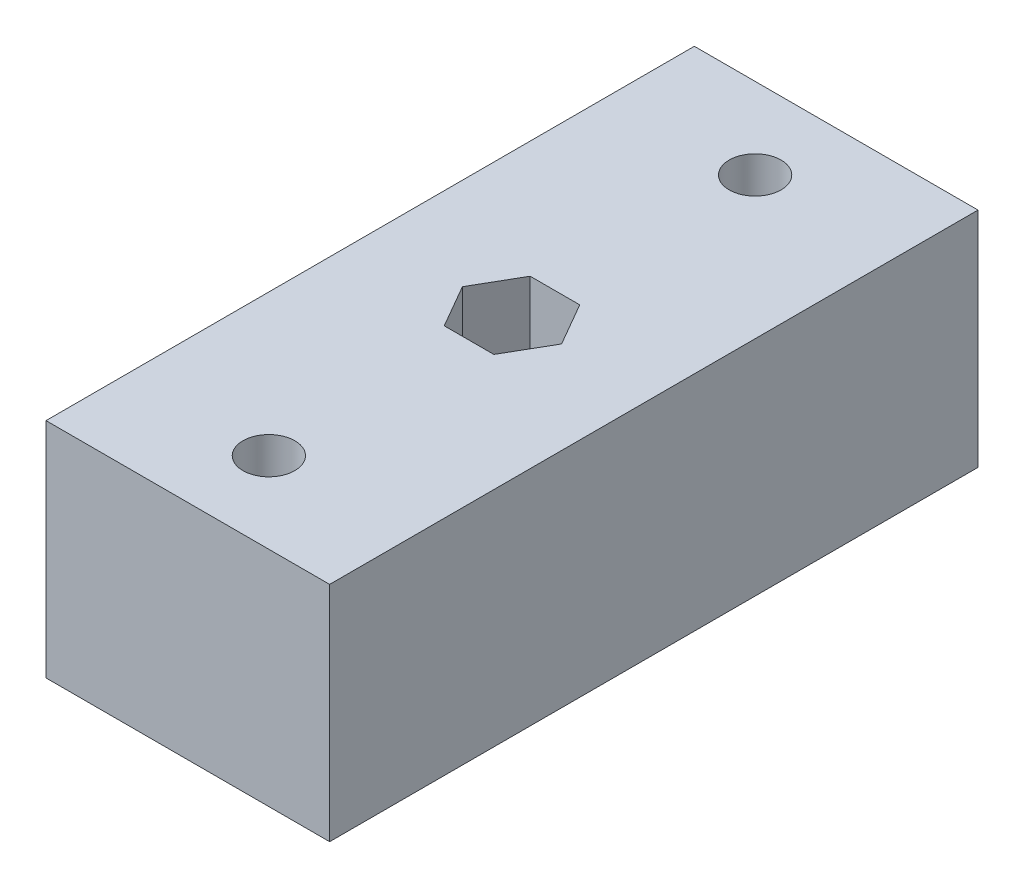
ISO-10303-21;
HEADER;
FILE_DESCRIPTION(('STEP AP214'),'2;1');
FILE_NAME('part.step','',(''),(''),'','','');
FILE_SCHEMA(('AUTOMOTIVE_DESIGN { 1 0 10303 214 1 1 1 1 }'));
ENDSEC;
DATA;
#1=APPLICATION_CONTEXT('core data for automotive mechanical design processes');
#2=APPLICATION_PROTOCOL_DEFINITION('international standard','automotive_design',2000,#1);
#3=PRODUCT_CONTEXT('',#1,'mechanical');
#4=PRODUCT('Part','Part','',(#3));
#5=PRODUCT_RELATED_PRODUCT_CATEGORY('part','',(#4));
#6=PRODUCT_DEFINITION_FORMATION('','',#4);
#7=PRODUCT_DEFINITION_CONTEXT('part definition',#1,'design');
#8=PRODUCT_DEFINITION('design','',#6,#7);
#9=PRODUCT_DEFINITION_SHAPE('','',#8);
#10=(LENGTH_UNIT() NAMED_UNIT(*) SI_UNIT(.MILLI.,.METRE.));
#11=(NAMED_UNIT(*) PLANE_ANGLE_UNIT() SI_UNIT($,.RADIAN.));
#12=(NAMED_UNIT(*) SI_UNIT($,.STERADIAN.) SOLID_ANGLE_UNIT());
#13=UNCERTAINTY_MEASURE_WITH_UNIT(LENGTH_MEASURE(1.E-05),#10,'distance_accuracy_value','');
#14=(GEOMETRIC_REPRESENTATION_CONTEXT(3) GLOBAL_UNCERTAINTY_ASSIGNED_CONTEXT((#13)) GLOBAL_UNIT_ASSIGNED_CONTEXT((#10,
#11,#12)) REPRESENTATION_CONTEXT('',''));
#15=CARTESIAN_POINT('',(0.,0.,0.));
#16=DIRECTION('',(0.,0.,1.));
#17=DIRECTION('',(1.,0.,0.));
#18=AXIS2_PLACEMENT_3D('',#15,#16,#17);
#19=CARTESIAN_POINT('',(0.,0.,50.8));
#20=DIRECTION('',(1.,0.,0.));
#21=DIRECTION('',(0.,0.,-1.));
#22=AXIS2_PLACEMENT_3D('',#19,#20,#21);
#23=PLANE('',#22);
#24=DIRECTION('',(0.,-1.,0.));
#25=VECTOR('',#24,1.);
#26=CARTESIAN_POINT('',(0.,0.,0.));
#27=LINE('',#26,#25);
#28=CARTESIAN_POINT('',(0.,17.4625,0.));
#29=VERTEX_POINT('',#28);
#30=CARTESIAN_POINT('',(0.,0.,0.));
#31=VERTEX_POINT('',#30);
#32=EDGE_CURVE('E156',#29,#31,#27,.T.);
#33=ORIENTED_EDGE('',*,*,#32,.T.);
#34=DIRECTION('',(0.,0.,-1.));
#35=VECTOR('',#34,1.);
#36=CARTESIAN_POINT('',(0.,0.,50.8));
#37=LINE('',#36,#35);
#38=CARTESIAN_POINT('',(0.,0.,50.8));
#39=VERTEX_POINT('',#38);
#40=EDGE_CURVE('E11',#39,#31,#37,.T.);
#41=ORIENTED_EDGE('',*,*,#40,.F.);
#42=DIRECTION('',(0.,-1.,0.));
#43=VECTOR('',#42,1.);
#44=CARTESIAN_POINT('',(0.,0.,50.8));
#45=LINE('',#44,#43);
#46=CARTESIAN_POINT('',(0.,17.4625,50.8));
#47=VERTEX_POINT('',#46);
#48=EDGE_CURVE('E204',#47,#39,#45,.T.);
#49=ORIENTED_EDGE('',*,*,#48,.F.);
#50=DIRECTION('',(0.,0.,-1.));
#51=VECTOR('',#50,1.);
#52=CARTESIAN_POINT('',(0.,17.4625,50.8));
#53=LINE('',#52,#51);
#54=EDGE_CURVE('E220',#47,#29,#53,.T.);
#55=ORIENTED_EDGE('',*,*,#54,.T.);
#56=EDGE_LOOP('',(#33,#41,#49,#55));
#57=FACE_BOUND('',#56,.T.);
#58=ADVANCED_FACE('F44',(#57),#23,.F.);
#59=CARTESIAN_POINT('',(0.,0.,50.8));
#60=DIRECTION('',(0.,1.,0.));
#61=DIRECTION('',(0.,0.,1.));
#62=AXIS2_PLACEMENT_3D('',#59,#60,#61);
#63=PLANE('',#62);
#64=CARTESIAN_POINT('',(11.1125,0.,6.35));
#65=DIRECTION('',(0.,-1.,0.));
#66=DIRECTION('',(0.,0.,-1.));
#67=AXIS2_PLACEMENT_3D('',#64,#65,#66);
#68=CIRCLE('',#67,2.032);
#69=CARTESIAN_POINT('',(11.1125,0.,4.318));
#70=VERTEX_POINT('',#69);
#71=EDGE_CURVE('E313',#70,#70,#68,.T.);
#72=ORIENTED_EDGE('',*,*,#71,.F.);
#73=EDGE_LOOP('',(#72));
#74=FACE_BOUND('',#73,.T.);
#75=CARTESIAN_POINT('',(11.1125,0.,44.45));
#76=DIRECTION('',(0.,-1.,0.));
#77=DIRECTION('',(0.,0.,-1.));
#78=AXIS2_PLACEMENT_3D('',#75,#76,#77);
#79=CIRCLE('',#78,2.032);
#80=CARTESIAN_POINT('',(11.1125,0.,42.418));
#81=VERTEX_POINT('',#80);
#82=EDGE_CURVE('E305',#81,#81,#79,.T.);
#83=ORIENTED_EDGE('',*,*,#82,.F.);
#84=EDGE_LOOP('',(#83));
#85=FACE_BOUND('',#84,.T.);
#86=DIRECTION('',(-0.5,0.,0.866025403784438));
#87=VECTOR('',#86,1.);
#88=CARTESIAN_POINT('',(14.9986446619154,0.,25.4));
#89=LINE('',#88,#87);
#90=CARTESIAN_POINT('',(14.9986446619154,0.,25.4));
#91=VERTEX_POINT('',#90);
#92=CARTESIAN_POINT('',(13.0555723309577,0.,28.7655));
#93=VERTEX_POINT('',#92);
#94=EDGE_CURVE('E169',#91,#93,#89,.T.);
#95=ORIENTED_EDGE('',*,*,#94,.F.);
#96=DIRECTION('',(0.5,0.,0.866025403784439));
#97=VECTOR('',#96,1.);
#98=CARTESIAN_POINT('',(13.0555723309577,0.,22.0345));
#99=LINE('',#98,#97);
#100=CARTESIAN_POINT('',(13.0555723309577,0.,22.0345));
#101=VERTEX_POINT('',#100);
#102=EDGE_CURVE('E65',#101,#91,#99,.T.);
#103=ORIENTED_EDGE('',*,*,#102,.F.);
#104=DIRECTION('',(1.,0.,0.));
#105=VECTOR('',#104,1.);
#106=CARTESIAN_POINT('',(9.16942766904231,0.,22.0345));
#107=LINE('',#106,#105);
#108=CARTESIAN_POINT('',(9.16942766904231,0.,22.0345));
#109=VERTEX_POINT('',#108);
#110=EDGE_CURVE('E149',#109,#101,#107,.T.);
#111=ORIENTED_EDGE('',*,*,#110,.F.);
#112=DIRECTION('',(0.5,0.,-0.866025403784439));
#113=VECTOR('',#112,1.);
#114=CARTESIAN_POINT('',(7.22635533808462,0.,25.4));
#115=LINE('',#114,#113);
#116=CARTESIAN_POINT('',(7.22635533808462,0.,25.4));
#117=VERTEX_POINT('',#116);
#118=EDGE_CURVE('E184',#117,#109,#115,.T.);
#119=ORIENTED_EDGE('',*,*,#118,.F.);
#120=DIRECTION('',(-0.5,0.,-0.866025403784439));
#121=VECTOR('',#120,1.);
#122=CARTESIAN_POINT('',(9.16942766904231,0.,28.7655));
#123=LINE('',#122,#121);
#124=CARTESIAN_POINT('',(9.16942766904231,0.,28.7655));
#125=VERTEX_POINT('',#124);
#126=EDGE_CURVE('E180',#125,#117,#123,.T.);
#127=ORIENTED_EDGE('',*,*,#126,.F.);
#128=DIRECTION('',(-1.,0.,0.));
#129=VECTOR('',#128,1.);
#130=CARTESIAN_POINT('',(13.0555723309577,0.,28.7655));
#131=LINE('',#130,#129);
#132=EDGE_CURVE('E177',#93,#125,#131,.T.);
#133=ORIENTED_EDGE('',*,*,#132,.F.);
#134=EDGE_LOOP('',(#95,#103,#111,#119,#127,#133));
#135=FACE_BOUND('',#134,.T.);
#136=DIRECTION('',(1.,0.,0.));
#137=VECTOR('',#136,1.);
#138=CARTESIAN_POINT('',(0.,0.,0.));
#139=LINE('',#138,#137);
#140=CARTESIAN_POINT('',(22.225,0.,0.));
#141=VERTEX_POINT('',#140);
#142=EDGE_CURVE('E222',#31,#141,#139,.T.);
#143=ORIENTED_EDGE('',*,*,#142,.T.);
#144=DIRECTION('',(0.,0.,-1.));
#145=VECTOR('',#144,1.);
#146=CARTESIAN_POINT('',(22.225,0.,50.8));
#147=LINE('',#146,#145);
#148=CARTESIAN_POINT('',(22.225,0.,50.8));
#149=VERTEX_POINT('',#148);
#150=EDGE_CURVE('E52',#149,#141,#147,.T.);
#151=ORIENTED_EDGE('',*,*,#150,.F.);
#152=DIRECTION('',(1.,0.,0.));
#153=VECTOR('',#152,1.);
#154=CARTESIAN_POINT('',(0.,0.,50.8));
#155=LINE('',#154,#153);
#156=EDGE_CURVE('E208',#39,#149,#155,.T.);
#157=ORIENTED_EDGE('',*,*,#156,.F.);
#158=ORIENTED_EDGE('',*,*,#40,.T.);
#159=EDGE_LOOP('',(#143,#151,#157,#158));
#160=FACE_BOUND('',#159,.T.);
#161=ADVANCED_FACE('F254',(#74,#85,#135,#160),#63,.F.);
#162=CARTESIAN_POINT('',(22.225,0.,50.8));
#163=DIRECTION('',(-1.,0.,0.));
#164=DIRECTION('',(0.,0.,1.));
#165=AXIS2_PLACEMENT_3D('',#162,#163,#164);
#166=PLANE('',#165);
#167=DIRECTION('',(0.,1.,0.));
#168=VECTOR('',#167,1.);
#169=CARTESIAN_POINT('',(22.225,0.,0.));
#170=LINE('',#169,#168);
#171=CARTESIAN_POINT('',(22.225,17.4625,0.));
#172=VERTEX_POINT('',#171);
#173=EDGE_CURVE('E221',#141,#172,#170,.T.);
#174=ORIENTED_EDGE('',*,*,#173,.T.);
#175=DIRECTION('',(0.,0.,-1.));
#176=VECTOR('',#175,1.);
#177=CARTESIAN_POINT('',(22.225,17.4625,50.8));
#178=LINE('',#177,#176);
#179=CARTESIAN_POINT('',(22.225,17.4625,50.8));
#180=VERTEX_POINT('',#179);
#181=EDGE_CURVE('E232',#180,#172,#178,.T.);
#182=ORIENTED_EDGE('',*,*,#181,.F.);
#183=DIRECTION('',(0.,1.,0.));
#184=VECTOR('',#183,1.);
#185=CARTESIAN_POINT('',(22.225,0.,50.8));
#186=LINE('',#185,#184);
#187=EDGE_CURVE('E215',#149,#180,#186,.T.);
#188=ORIENTED_EDGE('',*,*,#187,.F.);
#189=ORIENTED_EDGE('',*,*,#150,.T.);
#190=EDGE_LOOP('',(#174,#182,#188,#189));
#191=FACE_BOUND('',#190,.T.);
#192=ADVANCED_FACE('F242',(#191),#166,.F.);
#193=CARTESIAN_POINT('',(0.,17.4625,50.8));
#194=DIRECTION('',(0.,-1.,0.));
#195=DIRECTION('',(0.,0.,-1.));
#196=AXIS2_PLACEMENT_3D('',#193,#194,#195);
#197=PLANE('',#196);
#198=CARTESIAN_POINT('',(11.1125,17.4625,6.35));
#199=DIRECTION('',(0.,-1.,0.));
#200=DIRECTION('',(0.,0.,-1.));
#201=AXIS2_PLACEMENT_3D('',#198,#199,#200);
#202=CIRCLE('',#201,2.032);
#203=CARTESIAN_POINT('',(11.1125,17.4625,4.318));
#204=VERTEX_POINT('',#203);
#205=EDGE_CURVE('E320',#204,#204,#202,.F.);
#206=ORIENTED_EDGE('',*,*,#205,.F.);
#207=EDGE_LOOP('',(#206));
#208=FACE_BOUND('',#207,.T.);
#209=CARTESIAN_POINT('',(11.1125,17.4625,44.45));
#210=DIRECTION('',(0.,-1.,0.));
#211=DIRECTION('',(0.,0.,-1.));
#212=AXIS2_PLACEMENT_3D('',#209,#210,#211);
#213=CIRCLE('',#212,2.032);
#214=CARTESIAN_POINT('',(11.1125,17.4625,42.418));
#215=VERTEX_POINT('',#214);
#216=EDGE_CURVE('E306',#215,#215,#213,.F.);
#217=ORIENTED_EDGE('',*,*,#216,.F.);
#218=EDGE_LOOP('',(#217));
#219=FACE_BOUND('',#218,.T.);
#220=DIRECTION('',(-1.,0.,0.));
#221=VECTOR('',#220,1.);
#222=CARTESIAN_POINT('',(9.16942766904231,17.4625,22.0345));
#223=LINE('',#222,#221);
#224=CARTESIAN_POINT('',(13.0555723309577,17.4625,22.0345));
#225=VERTEX_POINT('',#224);
#226=CARTESIAN_POINT('',(9.16942766904231,17.4625,22.0345));
#227=VERTEX_POINT('',#226);
#228=EDGE_CURVE('E162',#225,#227,#223,.T.);
#229=ORIENTED_EDGE('',*,*,#228,.F.);
#230=DIRECTION('',(-0.5,0.,-0.866025403784439));
#231=VECTOR('',#230,1.);
#232=CARTESIAN_POINT('',(13.0555723309577,17.4625,22.0345));
#233=LINE('',#232,#231);
#234=CARTESIAN_POINT('',(14.9986446619154,17.4625,25.4));
#235=VERTEX_POINT('',#234);
#236=EDGE_CURVE('E142',#235,#225,#233,.T.);
#237=ORIENTED_EDGE('',*,*,#236,.F.);
#238=DIRECTION('',(0.5,0.,-0.866025403784439));
#239=VECTOR('',#238,1.);
#240=CARTESIAN_POINT('',(14.9986446619154,17.4625,25.4));
#241=LINE('',#240,#239);
#242=CARTESIAN_POINT('',(13.0555723309577,17.4625,28.7655));
#243=VERTEX_POINT('',#242);
#244=EDGE_CURVE('E155',#243,#235,#241,.T.);
#245=ORIENTED_EDGE('',*,*,#244,.F.);
#246=DIRECTION('',(1.,0.,0.));
#247=VECTOR('',#246,1.);
#248=CARTESIAN_POINT('',(13.0555723309577,17.4625,28.7655));
#249=LINE('',#248,#247);
#250=CARTESIAN_POINT('',(9.16942766904231,17.4625,28.7655));
#251=VERTEX_POINT('',#250);
#252=EDGE_CURVE('E71',#251,#243,#249,.T.);
#253=ORIENTED_EDGE('',*,*,#252,.F.);
#254=DIRECTION('',(0.5,0.,0.866025403784439));
#255=VECTOR('',#254,1.);
#256=CARTESIAN_POINT('',(9.16942766904231,17.4625,28.7655));
#257=LINE('',#256,#255);
#258=CARTESIAN_POINT('',(7.22635533808462,17.4625,25.4));
#259=VERTEX_POINT('',#258);
#260=EDGE_CURVE('E324',#259,#251,#257,.T.);
#261=ORIENTED_EDGE('',*,*,#260,.F.);
#262=DIRECTION('',(-0.5,0.,0.866025403784439));
#263=VECTOR('',#262,1.);
#264=CARTESIAN_POINT('',(7.22635533808462,17.4625,25.4));
#265=LINE('',#264,#263);
#266=EDGE_CURVE('E172',#227,#259,#265,.T.);
#267=ORIENTED_EDGE('',*,*,#266,.F.);
#268=EDGE_LOOP('',(#229,#237,#245,#253,#261,#267));
#269=FACE_BOUND('',#268,.T.);
#270=DIRECTION('',(-1.,0.,0.));
#271=VECTOR('',#270,1.);
#272=CARTESIAN_POINT('',(0.,17.4625,0.));
#273=LINE('',#272,#271);
#274=EDGE_CURVE('E207',#172,#29,#273,.T.);
#275=ORIENTED_EDGE('',*,*,#274,.T.);
#276=ORIENTED_EDGE('',*,*,#54,.F.);
#277=DIRECTION('',(-1.,0.,0.));
#278=VECTOR('',#277,1.);
#279=CARTESIAN_POINT('',(0.,17.4625,50.8));
#280=LINE('',#279,#278);
#281=EDGE_CURVE('E212',#180,#47,#280,.T.);
#282=ORIENTED_EDGE('',*,*,#281,.F.);
#283=ORIENTED_EDGE('',*,*,#181,.T.);
#284=EDGE_LOOP('',(#275,#276,#282,#283));
#285=FACE_BOUND('',#284,.T.);
#286=ADVANCED_FACE('F157',(#208,#219,#269,#285),#197,.F.);
#287=CARTESIAN_POINT('',(0.,0.,50.8));
#288=DIRECTION('',(0.,0.,-1.));
#289=DIRECTION('',(-1.,0.,0.));
#290=AXIS2_PLACEMENT_3D('',#287,#288,#289);
#291=PLANE('',#290);
#292=ORIENTED_EDGE('',*,*,#48,.T.);
#293=ORIENTED_EDGE('',*,*,#156,.T.);
#294=ORIENTED_EDGE('',*,*,#187,.T.);
#295=ORIENTED_EDGE('',*,*,#281,.T.);
#296=EDGE_LOOP('',(#292,#293,#294,#295));
#297=FACE_BOUND('',#296,.T.);
#298=ADVANCED_FACE('F255',(#297),#291,.F.);
#299=CARTESIAN_POINT('',(0.,0.,0.));
#300=DIRECTION('',(0.,0.,-1.));
#301=DIRECTION('',(-1.,0.,0.));
#302=AXIS2_PLACEMENT_3D('',#299,#300,#301);
#303=PLANE('',#302);
#304=ORIENTED_EDGE('',*,*,#32,.F.);
#305=ORIENTED_EDGE('',*,*,#274,.F.);
#306=ORIENTED_EDGE('',*,*,#173,.F.);
#307=ORIENTED_EDGE('',*,*,#142,.F.);
#308=EDGE_LOOP('',(#304,#305,#306,#307));
#309=FACE_BOUND('',#308,.T.);
#310=ADVANCED_FACE('F247',(#309),#303,.T.);
#311=CARTESIAN_POINT('',(13.0555723309577,17.4635,22.0345));
#312=DIRECTION('',(0.866025403784439,0.,-0.5));
#313=DIRECTION('',(-0.5,0.,-0.866025403784439));
#314=AXIS2_PLACEMENT_3D('',#311,#312,#313);
#315=PLANE('',#314);
#316=ORIENTED_EDGE('',*,*,#236,.T.);
#317=DIRECTION('',(0.,-1.,0.));
#318=VECTOR('',#317,1.);
#319=CARTESIAN_POINT('',(13.0555723309577,17.4635,22.0345));
#320=LINE('',#319,#318);
#321=EDGE_CURVE('E160',#225,#101,#320,.T.);
#322=ORIENTED_EDGE('',*,*,#321,.T.);
#323=ORIENTED_EDGE('',*,*,#102,.T.);
#324=DIRECTION('',(0.,-1.,0.));
#325=VECTOR('',#324,1.);
#326=CARTESIAN_POINT('',(14.9986446619154,17.4635,25.4));
#327=LINE('',#326,#325);
#328=EDGE_CURVE('E139',#235,#91,#327,.T.);
#329=ORIENTED_EDGE('',*,*,#328,.F.);
#330=EDGE_LOOP('',(#316,#322,#323,#329));
#331=FACE_BOUND('',#330,.T.);
#332=ADVANCED_FACE('F140',(#331),#315,.F.);
#333=CARTESIAN_POINT('',(9.16942766904231,17.4635,22.0345));
#334=DIRECTION('',(0.,0.,-1.));
#335=DIRECTION('',(-1.,0.,0.));
#336=AXIS2_PLACEMENT_3D('',#333,#334,#335);
#337=PLANE('',#336);
#338=ORIENTED_EDGE('',*,*,#228,.T.);
#339=DIRECTION('',(0.,-1.,0.));
#340=VECTOR('',#339,1.);
#341=CARTESIAN_POINT('',(9.16942766904231,17.4635,22.0345));
#342=LINE('',#341,#340);
#343=EDGE_CURVE('E194',#227,#109,#342,.T.);
#344=ORIENTED_EDGE('',*,*,#343,.T.);
#345=ORIENTED_EDGE('',*,*,#110,.T.);
#346=ORIENTED_EDGE('',*,*,#321,.F.);
#347=EDGE_LOOP('',(#338,#344,#345,#346));
#348=FACE_BOUND('',#347,.T.);
#349=ADVANCED_FACE('F274',(#348),#337,.F.);
#350=CARTESIAN_POINT('',(7.22635533808462,17.4635,25.4));
#351=DIRECTION('',(-0.866025403784439,0.,-0.5));
#352=DIRECTION('',(-0.5,0.,0.866025403784439));
#353=AXIS2_PLACEMENT_3D('',#350,#351,#352);
#354=PLANE('',#353);
#355=ORIENTED_EDGE('',*,*,#266,.T.);
#356=DIRECTION('',(0.,-1.,0.));
#357=VECTOR('',#356,1.);
#358=CARTESIAN_POINT('',(7.22635533808462,17.4635,25.4));
#359=LINE('',#358,#357);
#360=EDGE_CURVE('E198',#259,#117,#359,.T.);
#361=ORIENTED_EDGE('',*,*,#360,.T.);
#362=ORIENTED_EDGE('',*,*,#118,.T.);
#363=ORIENTED_EDGE('',*,*,#343,.F.);
#364=EDGE_LOOP('',(#355,#361,#362,#363));
#365=FACE_BOUND('',#364,.T.);
#366=ADVANCED_FACE('F281',(#365),#354,.F.);
#367=CARTESIAN_POINT('',(9.16942766904231,17.4635,28.7655));
#368=DIRECTION('',(-0.866025403784439,0.,0.5));
#369=DIRECTION('',(0.5,0.,0.866025403784439));
#370=AXIS2_PLACEMENT_3D('',#367,#368,#369);
#371=PLANE('',#370);
#372=ORIENTED_EDGE('',*,*,#260,.T.);
#373=DIRECTION('',(0.,-1.,0.));
#374=VECTOR('',#373,1.);
#375=CARTESIAN_POINT('',(9.16942766904231,17.4635,28.7655));
#376=LINE('',#375,#374);
#377=EDGE_CURVE('E200',#251,#125,#376,.T.);
#378=ORIENTED_EDGE('',*,*,#377,.T.);
#379=ORIENTED_EDGE('',*,*,#126,.T.);
#380=ORIENTED_EDGE('',*,*,#360,.F.);
#381=EDGE_LOOP('',(#372,#378,#379,#380));
#382=FACE_BOUND('',#381,.T.);
#383=ADVANCED_FACE('F282',(#382),#371,.F.);
#384=CARTESIAN_POINT('',(13.0555723309577,17.4635,28.7655));
#385=DIRECTION('',(0.,0.,1.));
#386=DIRECTION('',(1.,0.,0.));
#387=AXIS2_PLACEMENT_3D('',#384,#385,#386);
#388=PLANE('',#387);
#389=ORIENTED_EDGE('',*,*,#252,.T.);
#390=DIRECTION('',(0.,-1.,0.));
#391=VECTOR('',#390,1.);
#392=CARTESIAN_POINT('',(13.0555723309577,17.4635,28.7655));
#393=LINE('',#392,#391);
#394=EDGE_CURVE('E146',#243,#93,#393,.T.);
#395=ORIENTED_EDGE('',*,*,#394,.T.);
#396=ORIENTED_EDGE('',*,*,#132,.T.);
#397=ORIENTED_EDGE('',*,*,#377,.F.);
#398=EDGE_LOOP('',(#389,#395,#396,#397));
#399=FACE_BOUND('',#398,.T.);
#400=ADVANCED_FACE('F279',(#399),#388,.F.);
#401=CARTESIAN_POINT('',(14.9986446619154,17.4635,25.4));
#402=DIRECTION('',(0.866025403784439,0.,0.5));
#403=DIRECTION('',(0.5,0.,-0.866025403784439));
#404=AXIS2_PLACEMENT_3D('',#401,#402,#403);
#405=PLANE('',#404);
#406=ORIENTED_EDGE('',*,*,#244,.T.);
#407=ORIENTED_EDGE('',*,*,#328,.T.);
#408=ORIENTED_EDGE('',*,*,#94,.T.);
#409=ORIENTED_EDGE('',*,*,#394,.F.);
#410=EDGE_LOOP('',(#406,#407,#408,#409));
#411=FACE_BOUND('',#410,.T.);
#412=ADVANCED_FACE('F153',(#411),#405,.F.);
#413=CARTESIAN_POINT('',(11.1125,17.4635,44.45));
#414=DIRECTION('',(0.,-1.,0.));
#415=DIRECTION('',(0.,0.,-1.));
#416=AXIS2_PLACEMENT_3D('',#413,#414,#415);
#417=CYLINDRICAL_SURFACE('',#416,2.032);
#418=ORIENTED_EDGE('',*,*,#82,.T.);
#419=EDGE_LOOP('',(#418));
#420=FACE_BOUND('',#419,.T.);
#421=ORIENTED_EDGE('',*,*,#216,.T.);
#422=EDGE_LOOP('',(#421));
#423=FACE_BOUND('',#422,.T.);
#424=ADVANCED_FACE('F280',(#420,#423),#417,.F.);
#425=CARTESIAN_POINT('',(11.1125,17.4635,6.35));
#426=DIRECTION('',(0.,-1.,0.));
#427=DIRECTION('',(0.,0.,-1.));
#428=AXIS2_PLACEMENT_3D('',#425,#426,#427);
#429=CYLINDRICAL_SURFACE('',#428,2.032);
#430=ORIENTED_EDGE('',*,*,#71,.T.);
#431=EDGE_LOOP('',(#430));
#432=FACE_BOUND('',#431,.T.);
#433=ORIENTED_EDGE('',*,*,#205,.T.);
#434=EDGE_LOOP('',(#433));
#435=FACE_BOUND('',#434,.T.);
#436=ADVANCED_FACE('F295',(#432,#435),#429,.F.);
#437=CLOSED_SHELL('',(#58,#161,#192,#286,#298,#310,#332,#349,#366,#383,#400,#412,#424,#436));
#438=MANIFOLD_SOLID_BREP('B2',#437);
#439=ADVANCED_BREP_SHAPE_REPRESENTATION('',(#18,#438),#14);
#440=SHAPE_DEFINITION_REPRESENTATION(#9,#439);
ENDSEC;
END-ISO-10303-21;
